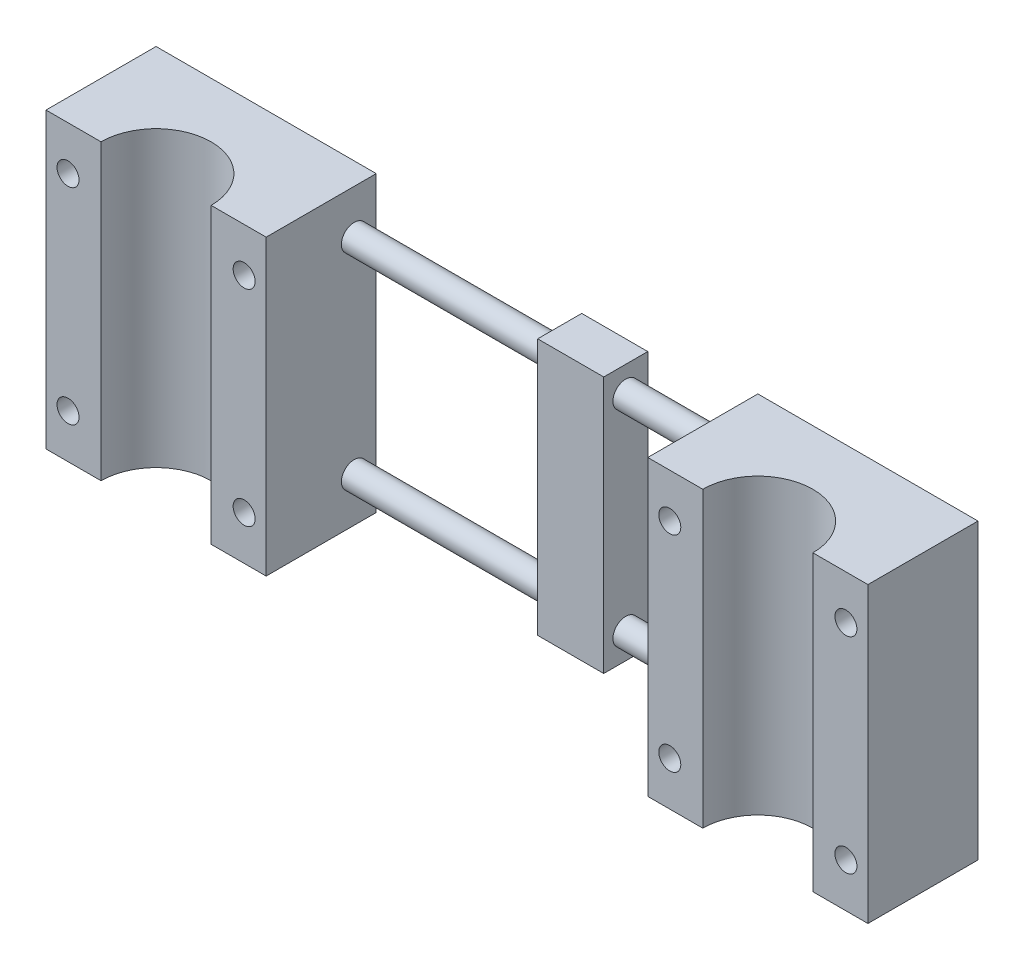
ISO-10303-21;
HEADER;
FILE_DESCRIPTION(('STEP AP214'),'2;1');
FILE_NAME('part.step','',(''),(''),'','','');
FILE_SCHEMA(('AUTOMOTIVE_DESIGN { 1 0 10303 214 1 1 1 1 }'));
ENDSEC;
DATA;
#1=APPLICATION_CONTEXT('core data for automotive mechanical design processes');
#2=APPLICATION_PROTOCOL_DEFINITION('international standard','automotive_design',2000,#1);
#3=PRODUCT_CONTEXT('',#1,'mechanical');
#4=PRODUCT('Part','Part','',(#3));
#5=PRODUCT_RELATED_PRODUCT_CATEGORY('part','',(#4));
#6=PRODUCT_DEFINITION_FORMATION('','',#4);
#7=PRODUCT_DEFINITION_CONTEXT('part definition',#1,'design');
#8=PRODUCT_DEFINITION('design','',#6,#7);
#9=PRODUCT_DEFINITION_SHAPE('','',#8);
#10=(LENGTH_UNIT() NAMED_UNIT(*) SI_UNIT(.MILLI.,.METRE.));
#11=(NAMED_UNIT(*) PLANE_ANGLE_UNIT() SI_UNIT($,.RADIAN.));
#12=(NAMED_UNIT(*) SI_UNIT($,.STERADIAN.) SOLID_ANGLE_UNIT());
#13=UNCERTAINTY_MEASURE_WITH_UNIT(LENGTH_MEASURE(1.E-05),#10,'distance_accuracy_value','');
#14=(GEOMETRIC_REPRESENTATION_CONTEXT(3) GLOBAL_UNCERTAINTY_ASSIGNED_CONTEXT((#13)) GLOBAL_UNIT_ASSIGNED_CONTEXT((#10,
#11,#12)) REPRESENTATION_CONTEXT('',''));
#15=CARTESIAN_POINT('',(0.,0.,0.));
#16=DIRECTION('',(0.,0.,1.));
#17=DIRECTION('',(1.,0.,0.));
#18=AXIS2_PLACEMENT_3D('',#15,#16,#17);
#19=CARTESIAN_POINT('',(112.,40.,15.));
#20=DIRECTION('',(0.,0.,-1.));
#21=DIRECTION('',(-1.,0.,0.));
#22=AXIS2_PLACEMENT_3D('',#19,#20,#21);
#23=PLANE('',#22);
#24=CARTESIAN_POINT('',(85.,6.,15.));
#25=DIRECTION('',(0.,0.,1.));
#26=DIRECTION('',(1.,0.,0.));
#27=AXIS2_PLACEMENT_3D('',#24,#25,#26);
#28=CIRCLE('',#27,1.5);
#29=CARTESIAN_POINT('',(86.5,6.,15.));
#30=VERTEX_POINT('',#29);
#31=EDGE_CURVE('E368',#30,#30,#28,.T.);
#32=ORIENTED_EDGE('',*,*,#31,.F.);
#33=EDGE_LOOP('',(#32));
#34=FACE_BOUND('',#33,.T.);
#35=CARTESIAN_POINT('',(85.,34.,15.));
#36=DIRECTION('',(0.,0.,1.));
#37=DIRECTION('',(1.,0.,0.));
#38=AXIS2_PLACEMENT_3D('',#35,#36,#37);
#39=CIRCLE('',#38,1.5);
#40=CARTESIAN_POINT('',(86.5,34.,15.));
#41=VERTEX_POINT('',#40);
#42=EDGE_CURVE('E296',#41,#41,#39,.T.);
#43=ORIENTED_EDGE('',*,*,#42,.F.);
#44=EDGE_LOOP('',(#43));
#45=FACE_BOUND('',#44,.T.);
#46=DIRECTION('',(-1.,0.,0.));
#47=VECTOR('',#46,1.);
#48=CARTESIAN_POINT('',(112.,0.,15.));
#49=LINE('',#48,#47);
#50=CARTESIAN_POINT('',(89.5,0.,15.));
#51=VERTEX_POINT('',#50);
#52=CARTESIAN_POINT('',(82.,0.,15.));
#53=VERTEX_POINT('',#52);
#54=EDGE_CURVE('E162',#51,#53,#49,.T.);
#55=ORIENTED_EDGE('',*,*,#54,.F.);
#56=DIRECTION('',(0.,1.,0.));
#57=VECTOR('',#56,1.);
#58=CARTESIAN_POINT('',(89.5,-19.,15.));
#59=LINE('',#58,#57);
#60=CARTESIAN_POINT('',(89.5,40.,15.));
#61=VERTEX_POINT('',#60);
#62=EDGE_CURVE('E52',#51,#61,#59,.T.);
#63=ORIENTED_EDGE('',*,*,#62,.T.);
#64=DIRECTION('',(-1.,0.,0.));
#65=VECTOR('',#64,1.);
#66=CARTESIAN_POINT('',(112.,40.,15.));
#67=LINE('',#66,#65);
#68=CARTESIAN_POINT('',(82.,40.,15.));
#69=VERTEX_POINT('',#68);
#70=EDGE_CURVE('E160',#61,#69,#67,.T.);
#71=ORIENTED_EDGE('',*,*,#70,.T.);
#72=DIRECTION('',(0.,-1.,0.));
#73=VECTOR('',#72,1.);
#74=CARTESIAN_POINT('',(82.,40.,15.));
#75=LINE('',#74,#73);
#76=EDGE_CURVE('E324',#69,#53,#75,.T.);
#77=ORIENTED_EDGE('',*,*,#76,.T.);
#78=EDGE_LOOP('',(#55,#63,#71,#77));
#79=FACE_BOUND('',#78,.T.);
#80=ADVANCED_FACE('F35',(#34,#45,#79),#23,.F.);
#81=CARTESIAN_POINT('',(0.,0.,15.));
#82=DIRECTION('',(0.,0.,-1.));
#83=DIRECTION('',(-1.,0.,0.));
#84=AXIS2_PLACEMENT_3D('',#81,#82,#83);
#85=PLANE('',#84);
#86=CARTESIAN_POINT('',(3.,6.,15.));
#87=DIRECTION('',(0.,0.,1.));
#88=DIRECTION('',(1.,0.,0.));
#89=AXIS2_PLACEMENT_3D('',#86,#87,#88);
#90=CIRCLE('',#89,1.5);
#91=CARTESIAN_POINT('',(4.5,6.,15.));
#92=VERTEX_POINT('',#91);
#93=EDGE_CURVE('E220',#92,#92,#90,.T.);
#94=ORIENTED_EDGE('',*,*,#93,.F.);
#95=EDGE_LOOP('',(#94));
#96=FACE_BOUND('',#95,.T.);
#97=CARTESIAN_POINT('',(3.,34.,15.));
#98=DIRECTION('',(0.,0.,1.));
#99=DIRECTION('',(1.,0.,0.));
#100=AXIS2_PLACEMENT_3D('',#97,#98,#99);
#101=CIRCLE('',#100,1.5);
#102=CARTESIAN_POINT('',(4.5,34.,15.));
#103=VERTEX_POINT('',#102);
#104=EDGE_CURVE('E229',#103,#103,#101,.T.);
#105=ORIENTED_EDGE('',*,*,#104,.F.);
#106=EDGE_LOOP('',(#105));
#107=FACE_BOUND('',#106,.T.);
#108=DIRECTION('',(1.,0.,0.));
#109=VECTOR('',#108,1.);
#110=CARTESIAN_POINT('',(0.,0.,15.));
#111=LINE('',#110,#109);
#112=CARTESIAN_POINT('',(0.,0.,15.));
#113=VERTEX_POINT('',#112);
#114=CARTESIAN_POINT('',(7.5,0.,15.));
#115=VERTEX_POINT('',#114);
#116=EDGE_CURVE('E243',#113,#115,#111,.T.);
#117=ORIENTED_EDGE('',*,*,#116,.T.);
#118=DIRECTION('',(0.,1.,0.));
#119=VECTOR('',#118,1.);
#120=CARTESIAN_POINT('',(7.5,-9.00000000000001,15.));
#121=LINE('',#120,#119);
#122=CARTESIAN_POINT('',(7.5,40.,15.));
#123=VERTEX_POINT('',#122);
#124=EDGE_CURVE('E273',#115,#123,#121,.T.);
#125=ORIENTED_EDGE('',*,*,#124,.T.);
#126=DIRECTION('',(-1.,0.,0.));
#127=VECTOR('',#126,1.);
#128=CARTESIAN_POINT('',(0.,40.,15.));
#129=LINE('',#128,#127);
#130=CARTESIAN_POINT('',(0.,40.,15.));
#131=VERTEX_POINT('',#130);
#132=EDGE_CURVE('E248',#123,#131,#129,.T.);
#133=ORIENTED_EDGE('',*,*,#132,.T.);
#134=DIRECTION('',(0.,-1.,0.));
#135=VECTOR('',#134,1.);
#136=CARTESIAN_POINT('',(0.,0.,15.));
#137=LINE('',#136,#135);
#138=EDGE_CURVE('E238',#131,#113,#137,.T.);
#139=ORIENTED_EDGE('',*,*,#138,.T.);
#140=EDGE_LOOP('',(#117,#125,#133,#139));
#141=FACE_BOUND('',#140,.T.);
#142=ADVANCED_FACE('F357',(#96,#107,#141),#85,.F.);
#143=CARTESIAN_POINT('',(0.,0.,15.));
#144=DIRECTION('',(1.,0.,0.));
#145=DIRECTION('',(0.,0.,-1.));
#146=AXIS2_PLACEMENT_3D('',#143,#144,#145);
#147=PLANE('',#146);
#148=DIRECTION('',(0.,-1.,0.));
#149=VECTOR('',#148,1.);
#150=CARTESIAN_POINT('',(0.,0.,0.));
#151=LINE('',#150,#149);
#152=CARTESIAN_POINT('',(0.,40.,0.));
#153=VERTEX_POINT('',#152);
#154=CARTESIAN_POINT('',(0.,0.,0.));
#155=VERTEX_POINT('',#154);
#156=EDGE_CURVE('E237',#153,#155,#151,.T.);
#157=ORIENTED_EDGE('',*,*,#156,.T.);
#158=DIRECTION('',(0.,0.,-1.));
#159=VECTOR('',#158,1.);
#160=CARTESIAN_POINT('',(0.,0.,15.));
#161=LINE('',#160,#159);
#162=EDGE_CURVE('E268',#113,#155,#161,.T.);
#163=ORIENTED_EDGE('',*,*,#162,.F.);
#164=ORIENTED_EDGE('',*,*,#138,.F.);
#165=DIRECTION('',(0.,0.,-1.));
#166=VECTOR('',#165,1.);
#167=CARTESIAN_POINT('',(0.,40.,15.));
#168=LINE('',#167,#166);
#169=EDGE_CURVE('E252',#131,#153,#168,.T.);
#170=ORIENTED_EDGE('',*,*,#169,.T.);
#171=EDGE_LOOP('',(#157,#163,#164,#170));
#172=FACE_BOUND('',#171,.T.);
#173=ADVANCED_FACE('F37',(#172),#147,.F.);
#174=CARTESIAN_POINT('',(0.,0.,15.));
#175=DIRECTION('',(0.,1.,0.));
#176=DIRECTION('',(0.,0.,1.));
#177=AXIS2_PLACEMENT_3D('',#174,#175,#176);
#178=PLANE('',#177);
#179=CARTESIAN_POINT('',(22.5,0.,15.));
#180=VERTEX_POINT('',#179);
#181=CARTESIAN_POINT('',(30.,0.,15.));
#182=VERTEX_POINT('',#181);
#183=EDGE_CURVE('E241',#180,#182,#111,.T.);
#184=ORIENTED_EDGE('',*,*,#183,.F.);
#185=CARTESIAN_POINT('',(15.,0.,15.));
#186=DIRECTION('',(0.,1.,0.));
#187=DIRECTION('',(0.,0.,1.));
#188=AXIS2_PLACEMENT_3D('',#185,#186,#187);
#189=CIRCLE('',#188,7.5);
#190=EDGE_CURVE('E59',#180,#115,#189,.T.);
#191=ORIENTED_EDGE('',*,*,#190,.T.);
#192=ORIENTED_EDGE('',*,*,#116,.F.);
#193=ORIENTED_EDGE('',*,*,#162,.T.);
#194=DIRECTION('',(1.,0.,0.));
#195=VECTOR('',#194,1.);
#196=CARTESIAN_POINT('',(0.,0.,0.));
#197=LINE('',#196,#195);
#198=CARTESIAN_POINT('',(30.,0.,0.));
#199=VERTEX_POINT('',#198);
#200=EDGE_CURVE('E255',#155,#199,#197,.T.);
#201=ORIENTED_EDGE('',*,*,#200,.T.);
#202=DIRECTION('',(0.,0.,-1.));
#203=VECTOR('',#202,1.);
#204=CARTESIAN_POINT('',(30.,0.,15.));
#205=LINE('',#204,#203);
#206=EDGE_CURVE('E265',#182,#199,#205,.T.);
#207=ORIENTED_EDGE('',*,*,#206,.F.);
#208=EDGE_LOOP('',(#184,#191,#192,#193,#201,#207));
#209=FACE_BOUND('',#208,.T.);
#210=ADVANCED_FACE('F507',(#209),#178,.F.);
#211=CARTESIAN_POINT('',(30.,0.,15.));
#212=DIRECTION('',(-1.,0.,0.));
#213=DIRECTION('',(0.,0.,1.));
#214=AXIS2_PLACEMENT_3D('',#211,#212,#213);
#215=PLANE('',#214);
#216=CARTESIAN_POINT('',(30.,6.,3.));
#217=DIRECTION('',(-1.,0.,0.));
#218=DIRECTION('',(0.,0.,1.));
#219=AXIS2_PLACEMENT_3D('',#216,#217,#218);
#220=CIRCLE('',#219,1.75);
#221=CARTESIAN_POINT('',(30.,6.,4.75));
#222=VERTEX_POINT('',#221);
#223=EDGE_CURVE('E288',#222,#222,#220,.F.);
#224=ORIENTED_EDGE('',*,*,#223,.F.);
#225=EDGE_LOOP('',(#224));
#226=FACE_BOUND('',#225,.T.);
#227=CARTESIAN_POINT('',(30.,34.,3.));
#228=DIRECTION('',(-1.,0.,0.));
#229=DIRECTION('',(0.,0.,1.));
#230=AXIS2_PLACEMENT_3D('',#227,#228,#229);
#231=CIRCLE('',#230,1.75);
#232=CARTESIAN_POINT('',(30.,34.,4.75));
#233=VERTEX_POINT('',#232);
#234=EDGE_CURVE('E276',#233,#233,#231,.F.);
#235=ORIENTED_EDGE('',*,*,#234,.F.);
#236=EDGE_LOOP('',(#235));
#237=FACE_BOUND('',#236,.T.);
#238=DIRECTION('',(0.,1.,0.));
#239=VECTOR('',#238,1.);
#240=CARTESIAN_POINT('',(30.,0.,0.));
#241=LINE('',#240,#239);
#242=CARTESIAN_POINT('',(30.,40.,0.));
#243=VERTEX_POINT('',#242);
#244=EDGE_CURVE('E257',#199,#243,#241,.T.);
#245=ORIENTED_EDGE('',*,*,#244,.T.);
#246=DIRECTION('',(0.,0.,-1.));
#247=VECTOR('',#246,1.);
#248=CARTESIAN_POINT('',(30.,40.,15.));
#249=LINE('',#248,#247);
#250=CARTESIAN_POINT('',(30.,40.,15.));
#251=VERTEX_POINT('',#250);
#252=EDGE_CURVE('E262',#251,#243,#249,.T.);
#253=ORIENTED_EDGE('',*,*,#252,.F.);
#254=DIRECTION('',(0.,1.,0.));
#255=VECTOR('',#254,1.);
#256=CARTESIAN_POINT('',(30.,0.,15.));
#257=LINE('',#256,#255);
#258=EDGE_CURVE('E246',#182,#251,#257,.T.);
#259=ORIENTED_EDGE('',*,*,#258,.F.);
#260=ORIENTED_EDGE('',*,*,#206,.T.);
#261=EDGE_LOOP('',(#245,#253,#259,#260));
#262=FACE_BOUND('',#261,.T.);
#263=ADVANCED_FACE('F504',(#226,#237,#262),#215,.F.);
#264=CARTESIAN_POINT('',(0.,40.,15.));
#265=DIRECTION('',(0.,-1.,0.));
#266=DIRECTION('',(0.,0.,-1.));
#267=AXIS2_PLACEMENT_3D('',#264,#265,#266);
#268=PLANE('',#267);
#269=ORIENTED_EDGE('',*,*,#132,.F.);
#270=CARTESIAN_POINT('',(15.,40.,15.));
#271=DIRECTION('',(0.,1.,0.));
#272=DIRECTION('',(0.,0.,1.));
#273=AXIS2_PLACEMENT_3D('',#270,#271,#272);
#274=CIRCLE('',#273,7.5);
#275=CARTESIAN_POINT('',(22.5,40.,15.));
#276=VERTEX_POINT('',#275);
#277=EDGE_CURVE('E234',#276,#123,#274,.T.);
#278=ORIENTED_EDGE('',*,*,#277,.F.);
#279=EDGE_CURVE('E249',#251,#276,#129,.T.);
#280=ORIENTED_EDGE('',*,*,#279,.F.);
#281=ORIENTED_EDGE('',*,*,#252,.T.);
#282=DIRECTION('',(-1.,0.,0.));
#283=VECTOR('',#282,1.);
#284=CARTESIAN_POINT('',(0.,40.,0.));
#285=LINE('',#284,#283);
#286=EDGE_CURVE('E242',#243,#153,#285,.T.);
#287=ORIENTED_EDGE('',*,*,#286,.T.);
#288=ORIENTED_EDGE('',*,*,#169,.F.);
#289=EDGE_LOOP('',(#269,#278,#280,#281,#287,#288));
#290=FACE_BOUND('',#289,.T.);
#291=ADVANCED_FACE('F497',(#290),#268,.F.);
#292=CARTESIAN_POINT('',(27.,34.,15.));
#293=DIRECTION('',(0.,0.,1.));
#294=DIRECTION('',(1.,0.,0.));
#295=AXIS2_PLACEMENT_3D('',#292,#293,#294);
#296=CIRCLE('',#295,1.5);
#297=CARTESIAN_POINT('',(28.5,34.,15.));
#298=VERTEX_POINT('',#297);
#299=EDGE_CURVE('E224',#298,#298,#296,.T.);
#300=ORIENTED_EDGE('',*,*,#299,.F.);
#301=EDGE_LOOP('',(#300));
#302=FACE_BOUND('',#301,.T.);
#303=CARTESIAN_POINT('',(27.,6.,15.));
#304=DIRECTION('',(0.,0.,1.));
#305=DIRECTION('',(1.,0.,0.));
#306=AXIS2_PLACEMENT_3D('',#303,#304,#305);
#307=CIRCLE('',#306,1.5);
#308=CARTESIAN_POINT('',(28.5,6.,15.));
#309=VERTEX_POINT('',#308);
#310=EDGE_CURVE('E219',#309,#309,#307,.T.);
#311=ORIENTED_EDGE('',*,*,#310,.F.);
#312=EDGE_LOOP('',(#311));
#313=FACE_BOUND('',#312,.T.);
#314=ORIENTED_EDGE('',*,*,#279,.T.);
#315=DIRECTION('',(0.,1.,0.));
#316=VECTOR('',#315,1.);
#317=CARTESIAN_POINT('',(22.5,-9.00000000000001,15.));
#318=LINE('',#317,#316);
#319=EDGE_CURVE('E271',#276,#180,#318,.F.);
#320=ORIENTED_EDGE('',*,*,#319,.T.);
#321=ORIENTED_EDGE('',*,*,#183,.T.);
#322=ORIENTED_EDGE('',*,*,#258,.T.);
#323=EDGE_LOOP('',(#314,#320,#321,#322));
#324=FACE_BOUND('',#323,.T.);
#325=ADVANCED_FACE('F364',(#302,#313,#324),#85,.F.);
#326=CARTESIAN_POINT('',(0.,0.,0.));
#327=DIRECTION('',(0.,0.,-1.));
#328=DIRECTION('',(-1.,0.,0.));
#329=AXIS2_PLACEMENT_3D('',#326,#327,#328);
#330=PLANE('',#329);
#331=CARTESIAN_POINT('',(3.,6.,0.));
#332=DIRECTION('',(0.,0.,-1.));
#333=DIRECTION('',(-1.,0.,0.));
#334=AXIS2_PLACEMENT_3D('',#331,#332,#333);
#335=CIRCLE('',#334,1.5);
#336=CARTESIAN_POINT('',(1.5,6.,0.));
#337=VERTEX_POINT('',#336);
#338=EDGE_CURVE('E233',#337,#337,#335,.T.);
#339=ORIENTED_EDGE('',*,*,#338,.F.);
#340=EDGE_LOOP('',(#339));
#341=FACE_BOUND('',#340,.T.);
#342=CARTESIAN_POINT('',(27.,34.,0.));
#343=DIRECTION('',(0.,0.,-1.));
#344=DIRECTION('',(-1.,0.,0.));
#345=AXIS2_PLACEMENT_3D('',#342,#343,#344);
#346=CIRCLE('',#345,1.5);
#347=CARTESIAN_POINT('',(25.5,34.,0.));
#348=VERTEX_POINT('',#347);
#349=EDGE_CURVE('E281',#348,#348,#346,.T.);
#350=ORIENTED_EDGE('',*,*,#349,.F.);
#351=EDGE_LOOP('',(#350));
#352=FACE_BOUND('',#351,.T.);
#353=CARTESIAN_POINT('',(27.,6.,0.));
#354=DIRECTION('',(0.,0.,-1.));
#355=DIRECTION('',(-1.,0.,0.));
#356=AXIS2_PLACEMENT_3D('',#353,#354,#355);
#357=CIRCLE('',#356,1.5);
#358=CARTESIAN_POINT('',(25.5,6.,0.));
#359=VERTEX_POINT('',#358);
#360=EDGE_CURVE('E223',#359,#359,#357,.T.);
#361=ORIENTED_EDGE('',*,*,#360,.F.);
#362=EDGE_LOOP('',(#361));
#363=FACE_BOUND('',#362,.T.);
#364=CARTESIAN_POINT('',(3.,34.,0.));
#365=DIRECTION('',(0.,0.,-1.));
#366=DIRECTION('',(-1.,0.,0.));
#367=AXIS2_PLACEMENT_3D('',#364,#365,#366);
#368=CIRCLE('',#367,1.5);
#369=CARTESIAN_POINT('',(1.5,34.,0.));
#370=VERTEX_POINT('',#369);
#371=EDGE_CURVE('E232',#370,#370,#368,.T.);
#372=ORIENTED_EDGE('',*,*,#371,.F.);
#373=EDGE_LOOP('',(#372));
#374=FACE_BOUND('',#373,.T.);
#375=ORIENTED_EDGE('',*,*,#156,.F.);
#376=ORIENTED_EDGE('',*,*,#286,.F.);
#377=ORIENTED_EDGE('',*,*,#244,.F.);
#378=ORIENTED_EDGE('',*,*,#200,.F.);
#379=EDGE_LOOP('',(#375,#376,#377,#378));
#380=FACE_BOUND('',#379,.T.);
#381=ADVANCED_FACE('F494',(#341,#352,#363,#374,#380),#330,.T.);
#382=CARTESIAN_POINT('',(15.,-9.00000000000001,15.));
#383=DIRECTION('',(0.,1.,0.));
#384=DIRECTION('',(0.,0.,1.));
#385=AXIS2_PLACEMENT_3D('',#382,#383,#384);
#386=CYLINDRICAL_SURFACE('',#385,7.5);
#387=ORIENTED_EDGE('',*,*,#319,.F.);
#388=ORIENTED_EDGE('',*,*,#277,.T.);
#389=ORIENTED_EDGE('',*,*,#124,.F.);
#390=ORIENTED_EDGE('',*,*,#190,.F.);
#391=EDGE_LOOP('',(#387,#388,#389,#390));
#392=FACE_BOUND('',#391,.T.);
#393=ADVANCED_FACE('F491',(#392),#386,.F.);
#394=CARTESIAN_POINT('',(3.,34.,-34.));
#395=DIRECTION('',(0.,0.,1.));
#396=DIRECTION('',(1.,0.,0.));
#397=AXIS2_PLACEMENT_3D('',#394,#395,#396);
#398=CYLINDRICAL_SURFACE('',#397,1.5);
#399=ORIENTED_EDGE('',*,*,#371,.T.);
#400=EDGE_LOOP('',(#399));
#401=FACE_BOUND('',#400,.T.);
#402=ORIENTED_EDGE('',*,*,#104,.T.);
#403=EDGE_LOOP('',(#402));
#404=FACE_BOUND('',#403,.T.);
#405=ADVANCED_FACE('F487',(#401,#404),#398,.F.);
#406=CARTESIAN_POINT('',(27.,6.,-34.));
#407=DIRECTION('',(0.,0.,1.));
#408=DIRECTION('',(1.,0.,0.));
#409=AXIS2_PLACEMENT_3D('',#406,#407,#408);
#410=CYLINDRICAL_SURFACE('',#409,1.5);
#411=ORIENTED_EDGE('',*,*,#360,.T.);
#412=EDGE_LOOP('',(#411));
#413=FACE_BOUND('',#412,.T.);
#414=ORIENTED_EDGE('',*,*,#310,.T.);
#415=EDGE_LOOP('',(#414));
#416=FACE_BOUND('',#415,.T.);
#417=ADVANCED_FACE('F483',(#413,#416),#410,.F.);
#418=CARTESIAN_POINT('',(27.,34.,-34.));
#419=DIRECTION('',(0.,0.,1.));
#420=DIRECTION('',(1.,0.,0.));
#421=AXIS2_PLACEMENT_3D('',#418,#419,#420);
#422=CYLINDRICAL_SURFACE('',#421,1.5);
#423=ORIENTED_EDGE('',*,*,#349,.T.);
#424=EDGE_LOOP('',(#423));
#425=FACE_BOUND('',#424,.T.);
#426=ORIENTED_EDGE('',*,*,#299,.T.);
#427=EDGE_LOOP('',(#426));
#428=FACE_BOUND('',#427,.T.);
#429=ADVANCED_FACE('F479',(#425,#428),#422,.F.);
#430=CARTESIAN_POINT('',(3.,6.,-34.));
#431=DIRECTION('',(0.,0.,1.));
#432=DIRECTION('',(1.,0.,0.));
#433=AXIS2_PLACEMENT_3D('',#430,#431,#432);
#434=CYLINDRICAL_SURFACE('',#433,1.5);
#435=ORIENTED_EDGE('',*,*,#338,.T.);
#436=EDGE_LOOP('',(#435));
#437=FACE_BOUND('',#436,.T.);
#438=ORIENTED_EDGE('',*,*,#93,.T.);
#439=EDGE_LOOP('',(#438));
#440=FACE_BOUND('',#439,.T.);
#441=ADVANCED_FACE('F475',(#437,#440),#434,.F.);
#442=CARTESIAN_POINT('',(58.,34.,3.));
#443=DIRECTION('',(-1.,0.,0.));
#444=DIRECTION('',(0.,0.,1.));
#445=AXIS2_PLACEMENT_3D('',#442,#443,#444);
#446=CYLINDRICAL_SURFACE('',#445,1.75);
#447=CARTESIAN_POINT('',(58.,34.,3.));
#448=DIRECTION('',(1.,0.,0.));
#449=DIRECTION('',(0.,0.,-1.));
#450=AXIS2_PLACEMENT_3D('',#447,#448,#449);
#451=CIRCLE('',#450,1.75);
#452=CARTESIAN_POINT('',(58.,34.,1.25));
#453=VERTEX_POINT('',#452);
#454=EDGE_CURVE('E216',#453,#453,#451,.T.);
#455=ORIENTED_EDGE('',*,*,#454,.F.);
#456=EDGE_LOOP('',(#455));
#457=FACE_BOUND('',#456,.T.);
#458=ORIENTED_EDGE('',*,*,#234,.T.);
#459=EDGE_LOOP('',(#458));
#460=FACE_BOUND('',#459,.T.);
#461=ADVANCED_FACE('F471',(#457,#460),#446,.T.);
#462=CARTESIAN_POINT('',(58.,6.,3.));
#463=DIRECTION('',(-1.,0.,0.));
#464=DIRECTION('',(0.,0.,1.));
#465=AXIS2_PLACEMENT_3D('',#462,#463,#464);
#466=CYLINDRICAL_SURFACE('',#465,1.75);
#467=CARTESIAN_POINT('',(58.,6.,3.));
#468=DIRECTION('',(1.,0.,0.));
#469=DIRECTION('',(0.,0.,-1.));
#470=AXIS2_PLACEMENT_3D('',#467,#468,#469);
#471=CIRCLE('',#470,1.75);
#472=CARTESIAN_POINT('',(58.,6.,1.25));
#473=VERTEX_POINT('',#472);
#474=EDGE_CURVE('E213',#473,#473,#471,.T.);
#475=ORIENTED_EDGE('',*,*,#474,.F.);
#476=EDGE_LOOP('',(#475));
#477=FACE_BOUND('',#476,.T.);
#478=ORIENTED_EDGE('',*,*,#223,.T.);
#479=EDGE_LOOP('',(#478));
#480=FACE_BOUND('',#479,.T.);
#481=ADVANCED_FACE('F468',(#477,#480),#466,.T.);
#482=CARTESIAN_POINT('',(67.,37.5,0.));
#483=DIRECTION('',(0.,0.,1.));
#484=DIRECTION('',(0.,-1.,0.));
#485=AXIS2_PLACEMENT_3D('',#482,#483,#484);
#486=PLANE('',#485);
#487=DIRECTION('',(0.,1.,0.));
#488=VECTOR('',#487,1.);
#489=CARTESIAN_POINT('',(58.,37.5,0.));
#490=LINE('',#489,#488);
#491=CARTESIAN_POINT('',(58.,2.5,0.));
#492=VERTEX_POINT('',#491);
#493=CARTESIAN_POINT('',(58.,37.5,0.));
#494=VERTEX_POINT('',#493);
#495=EDGE_CURVE('E183',#492,#494,#490,.T.);
#496=ORIENTED_EDGE('',*,*,#495,.T.);
#497=DIRECTION('',(-1.,0.,0.));
#498=VECTOR('',#497,1.);
#499=CARTESIAN_POINT('',(67.,37.5,0.));
#500=LINE('',#499,#498);
#501=CARTESIAN_POINT('',(67.,37.5,0.));
#502=VERTEX_POINT('',#501);
#503=EDGE_CURVE('E210',#502,#494,#500,.T.);
#504=ORIENTED_EDGE('',*,*,#503,.F.);
#505=DIRECTION('',(0.,1.,0.));
#506=VECTOR('',#505,1.);
#507=CARTESIAN_POINT('',(67.,37.5,0.));
#508=LINE('',#507,#506);
#509=CARTESIAN_POINT('',(67.,2.5,0.));
#510=VERTEX_POINT('',#509);
#511=EDGE_CURVE('E184',#510,#502,#508,.T.);
#512=ORIENTED_EDGE('',*,*,#511,.F.);
#513=DIRECTION('',(-1.,0.,0.));
#514=VECTOR('',#513,1.);
#515=CARTESIAN_POINT('',(67.,2.5,0.));
#516=LINE('',#515,#514);
#517=EDGE_CURVE('E194',#510,#492,#516,.T.);
#518=ORIENTED_EDGE('',*,*,#517,.T.);
#519=EDGE_LOOP('',(#496,#504,#512,#518));
#520=FACE_BOUND('',#519,.T.);
#521=ADVANCED_FACE('F438',(#520),#486,.F.);
#522=CARTESIAN_POINT('',(67.,37.5,0.));
#523=DIRECTION('',(0.,-1.,0.));
#524=DIRECTION('',(0.,0.,-1.));
#525=AXIS2_PLACEMENT_3D('',#522,#523,#524);
#526=PLANE('',#525);
#527=DIRECTION('',(0.,0.,1.));
#528=VECTOR('',#527,1.);
#529=CARTESIAN_POINT('',(58.,37.5,0.));
#530=LINE('',#529,#528);
#531=CARTESIAN_POINT('',(58.,37.5,6.));
#532=VERTEX_POINT('',#531);
#533=EDGE_CURVE('E197',#494,#532,#530,.T.);
#534=ORIENTED_EDGE('',*,*,#533,.T.);
#535=DIRECTION('',(-1.,0.,0.));
#536=VECTOR('',#535,1.);
#537=CARTESIAN_POINT('',(67.,37.5,6.));
#538=LINE('',#537,#536);
#539=CARTESIAN_POINT('',(67.,37.5,6.));
#540=VERTEX_POINT('',#539);
#541=EDGE_CURVE('E207',#540,#532,#538,.T.);
#542=ORIENTED_EDGE('',*,*,#541,.F.);
#543=DIRECTION('',(0.,0.,1.));
#544=VECTOR('',#543,1.);
#545=CARTESIAN_POINT('',(67.,37.5,0.));
#546=LINE('',#545,#544);
#547=EDGE_CURVE('E187',#502,#540,#546,.T.);
#548=ORIENTED_EDGE('',*,*,#547,.F.);
#549=ORIENTED_EDGE('',*,*,#503,.T.);
#550=EDGE_LOOP('',(#534,#542,#548,#549));
#551=FACE_BOUND('',#550,.T.);
#552=ADVANCED_FACE('F441',(#551),#526,.F.);
#553=CARTESIAN_POINT('',(67.,37.5,6.));
#554=DIRECTION('',(0.,0.,-1.));
#555=DIRECTION('',(0.,1.,0.));
#556=AXIS2_PLACEMENT_3D('',#553,#554,#555);
#557=PLANE('',#556);
#558=DIRECTION('',(0.,-1.,0.));
#559=VECTOR('',#558,1.);
#560=CARTESIAN_POINT('',(58.,37.5,6.));
#561=LINE('',#560,#559);
#562=CARTESIAN_POINT('',(58.,2.5,6.));
#563=VERTEX_POINT('',#562);
#564=EDGE_CURVE('E199',#532,#563,#561,.T.);
#565=ORIENTED_EDGE('',*,*,#564,.T.);
#566=DIRECTION('',(-1.,0.,0.));
#567=VECTOR('',#566,1.);
#568=CARTESIAN_POINT('',(67.,2.5,6.));
#569=LINE('',#568,#567);
#570=CARTESIAN_POINT('',(67.,2.5,6.));
#571=VERTEX_POINT('',#570);
#572=EDGE_CURVE('E204',#571,#563,#569,.T.);
#573=ORIENTED_EDGE('',*,*,#572,.F.);
#574=DIRECTION('',(0.,-1.,0.));
#575=VECTOR('',#574,1.);
#576=CARTESIAN_POINT('',(67.,37.5,6.));
#577=LINE('',#576,#575);
#578=EDGE_CURVE('E190',#540,#571,#577,.T.);
#579=ORIENTED_EDGE('',*,*,#578,.F.);
#580=ORIENTED_EDGE('',*,*,#541,.T.);
#581=EDGE_LOOP('',(#565,#573,#579,#580));
#582=FACE_BOUND('',#581,.T.);
#583=ADVANCED_FACE('F446',(#582),#557,.F.);
#584=CARTESIAN_POINT('',(67.,2.5,0.));
#585=DIRECTION('',(0.,1.,0.));
#586=DIRECTION('',(0.,0.,1.));
#587=AXIS2_PLACEMENT_3D('',#584,#585,#586);
#588=PLANE('',#587);
#589=DIRECTION('',(0.,0.,-1.));
#590=VECTOR('',#589,1.);
#591=CARTESIAN_POINT('',(58.,2.5,0.));
#592=LINE('',#591,#590);
#593=EDGE_CURVE('E188',#563,#492,#592,.T.);
#594=ORIENTED_EDGE('',*,*,#593,.T.);
#595=ORIENTED_EDGE('',*,*,#517,.F.);
#596=DIRECTION('',(0.,0.,-1.));
#597=VECTOR('',#596,1.);
#598=CARTESIAN_POINT('',(67.,2.5,0.));
#599=LINE('',#598,#597);
#600=EDGE_CURVE('E192',#571,#510,#599,.T.);
#601=ORIENTED_EDGE('',*,*,#600,.F.);
#602=ORIENTED_EDGE('',*,*,#572,.T.);
#603=EDGE_LOOP('',(#594,#595,#601,#602));
#604=FACE_BOUND('',#603,.T.);
#605=ADVANCED_FACE('F428',(#604),#588,.F.);
#606=CARTESIAN_POINT('',(67.,0.,0.));
#607=DIRECTION('',(-1.,0.,0.));
#608=DIRECTION('',(0.,0.,1.));
#609=AXIS2_PLACEMENT_3D('',#606,#607,#608);
#610=PLANE('',#609);
#611=CARTESIAN_POINT('',(67.,6.,3.));
#612=DIRECTION('',(-1.,0.,0.));
#613=DIRECTION('',(0.,0.,1.));
#614=AXIS2_PLACEMENT_3D('',#611,#612,#613);
#615=CIRCLE('',#614,1.75);
#616=CARTESIAN_POINT('',(67.,6.,4.75));
#617=VERTEX_POINT('',#616);
#618=EDGE_CURVE('E44',#617,#617,#615,.F.);
#619=ORIENTED_EDGE('',*,*,#618,.F.);
#620=EDGE_LOOP('',(#619));
#621=FACE_BOUND('',#620,.T.);
#622=CARTESIAN_POINT('',(67.,34.,3.));
#623=DIRECTION('',(-1.,0.,0.));
#624=DIRECTION('',(0.,0.,1.));
#625=AXIS2_PLACEMENT_3D('',#622,#623,#624);
#626=CIRCLE('',#625,1.75);
#627=CARTESIAN_POINT('',(67.,34.,4.75));
#628=VERTEX_POINT('',#627);
#629=EDGE_CURVE('E291',#628,#628,#626,.F.);
#630=ORIENTED_EDGE('',*,*,#629,.F.);
#631=EDGE_LOOP('',(#630));
#632=FACE_BOUND('',#631,.T.);
#633=ORIENTED_EDGE('',*,*,#511,.T.);
#634=ORIENTED_EDGE('',*,*,#547,.T.);
#635=ORIENTED_EDGE('',*,*,#578,.T.);
#636=ORIENTED_EDGE('',*,*,#600,.T.);
#637=EDGE_LOOP('',(#633,#634,#635,#636));
#638=FACE_BOUND('',#637,.T.);
#639=ADVANCED_FACE('F424',(#621,#632,#638),#610,.F.);
#640=CARTESIAN_POINT('',(58.,0.,0.));
#641=DIRECTION('',(-1.,0.,0.));
#642=DIRECTION('',(0.,0.,1.));
#643=AXIS2_PLACEMENT_3D('',#640,#641,#642);
#644=PLANE('',#643);
#645=ORIENTED_EDGE('',*,*,#454,.T.);
#646=EDGE_LOOP('',(#645));
#647=FACE_BOUND('',#646,.T.);
#648=ORIENTED_EDGE('',*,*,#474,.T.);
#649=EDGE_LOOP('',(#648));
#650=FACE_BOUND('',#649,.T.);
#651=ORIENTED_EDGE('',*,*,#495,.F.);
#652=ORIENTED_EDGE('',*,*,#593,.F.);
#653=ORIENTED_EDGE('',*,*,#564,.F.);
#654=ORIENTED_EDGE('',*,*,#533,.F.);
#655=EDGE_LOOP('',(#651,#652,#653,#654));
#656=FACE_BOUND('',#655,.T.);
#657=ADVANCED_FACE('F427',(#647,#650,#656),#644,.T.);
#658=CARTESIAN_POINT('',(82.,34.,3.));
#659=DIRECTION('',(-1.,0.,0.));
#660=DIRECTION('',(0.,0.,1.));
#661=AXIS2_PLACEMENT_3D('',#658,#659,#660);
#662=CYLINDRICAL_SURFACE('',#661,1.75);
#663=CARTESIAN_POINT('',(82.,34.,3.));
#664=DIRECTION('',(1.,0.,0.));
#665=DIRECTION('',(0.,0.,-1.));
#666=AXIS2_PLACEMENT_3D('',#663,#664,#665);
#667=CIRCLE('',#666,1.75);
#668=CARTESIAN_POINT('',(82.,34.,1.25));
#669=VERTEX_POINT('',#668);
#670=EDGE_CURVE('E180',#669,#669,#667,.T.);
#671=ORIENTED_EDGE('',*,*,#670,.F.);
#672=EDGE_LOOP('',(#671));
#673=FACE_BOUND('',#672,.T.);
#674=ORIENTED_EDGE('',*,*,#629,.T.);
#675=EDGE_LOOP('',(#674));
#676=FACE_BOUND('',#675,.T.);
#677=ADVANCED_FACE('F420',(#673,#676),#662,.T.);
#678=CARTESIAN_POINT('',(82.,6.,3.));
#679=DIRECTION('',(-1.,0.,0.));
#680=DIRECTION('',(0.,0.,1.));
#681=AXIS2_PLACEMENT_3D('',#678,#679,#680);
#682=CYLINDRICAL_SURFACE('',#681,1.75);
#683=CARTESIAN_POINT('',(82.,6.,3.));
#684=DIRECTION('',(1.,0.,0.));
#685=DIRECTION('',(0.,0.,-1.));
#686=AXIS2_PLACEMENT_3D('',#683,#684,#685);
#687=CIRCLE('',#686,1.75);
#688=CARTESIAN_POINT('',(82.,6.,1.25));
#689=VERTEX_POINT('',#688);
#690=EDGE_CURVE('E177',#689,#689,#687,.T.);
#691=ORIENTED_EDGE('',*,*,#690,.F.);
#692=EDGE_LOOP('',(#691));
#693=FACE_BOUND('',#692,.T.);
#694=ORIENTED_EDGE('',*,*,#618,.T.);
#695=EDGE_LOOP('',(#694));
#696=FACE_BOUND('',#695,.T.);
#697=ADVANCED_FACE('F392',(#693,#696),#682,.T.);
#698=CARTESIAN_POINT('',(112.,40.,0.));
#699=DIRECTION('',(0.,0.,1.));
#700=DIRECTION('',(1.,0.,0.));
#701=AXIS2_PLACEMENT_3D('',#698,#699,#700);
#702=PLANE('',#701);
#703=CARTESIAN_POINT('',(109.,34.,0.));
#704=DIRECTION('',(0.,0.,1.));
#705=DIRECTION('',(1.,0.,0.));
#706=AXIS2_PLACEMENT_3D('',#703,#704,#705);
#707=CIRCLE('',#706,1.5);
#708=CARTESIAN_POINT('',(110.5,34.,0.));
#709=VERTEX_POINT('',#708);
#710=EDGE_CURVE('E304',#709,#709,#707,.T.);
#711=ORIENTED_EDGE('',*,*,#710,.T.);
#712=EDGE_LOOP('',(#711));
#713=FACE_BOUND('',#712,.T.);
#714=CARTESIAN_POINT('',(109.,6.,0.));
#715=DIRECTION('',(0.,0.,1.));
#716=DIRECTION('',(1.,0.,0.));
#717=AXIS2_PLACEMENT_3D('',#714,#715,#716);
#718=CIRCLE('',#717,1.5);
#719=CARTESIAN_POINT('',(110.5,6.,0.));
#720=VERTEX_POINT('',#719);
#721=EDGE_CURVE('E376',#720,#720,#718,.T.);
#722=ORIENTED_EDGE('',*,*,#721,.T.);
#723=EDGE_LOOP('',(#722));
#724=FACE_BOUND('',#723,.T.);
#725=CARTESIAN_POINT('',(85.,6.,0.));
#726=DIRECTION('',(0.,0.,1.));
#727=DIRECTION('',(1.,0.,0.));
#728=AXIS2_PLACEMENT_3D('',#725,#726,#727);
#729=CIRCLE('',#728,1.5);
#730=CARTESIAN_POINT('',(86.5,6.,0.));
#731=VERTEX_POINT('',#730);
#732=EDGE_CURVE('E39',#731,#731,#729,.T.);
#733=ORIENTED_EDGE('',*,*,#732,.T.);
#734=EDGE_LOOP('',(#733));
#735=FACE_BOUND('',#734,.T.);
#736=CARTESIAN_POINT('',(85.,34.,0.));
#737=DIRECTION('',(0.,0.,1.));
#738=DIRECTION('',(1.,0.,0.));
#739=AXIS2_PLACEMENT_3D('',#736,#737,#738);
#740=CIRCLE('',#739,1.5);
#741=CARTESIAN_POINT('',(86.5,34.,0.));
#742=VERTEX_POINT('',#741);
#743=EDGE_CURVE('E155',#742,#742,#740,.T.);
#744=ORIENTED_EDGE('',*,*,#743,.T.);
#745=EDGE_LOOP('',(#744));
#746=FACE_BOUND('',#745,.T.);
#747=DIRECTION('',(0.,1.,0.));
#748=VECTOR('',#747,1.);
#749=CARTESIAN_POINT('',(82.,40.,0.));
#750=LINE('',#749,#748);
#751=CARTESIAN_POINT('',(82.,0.,0.));
#752=VERTEX_POINT('',#751);
#753=CARTESIAN_POINT('',(82.,40.,0.));
#754=VERTEX_POINT('',#753);
#755=EDGE_CURVE('E308',#752,#754,#750,.T.);
#756=ORIENTED_EDGE('',*,*,#755,.T.);
#757=DIRECTION('',(-1.,0.,0.));
#758=VECTOR('',#757,1.);
#759=CARTESIAN_POINT('',(112.,40.,0.));
#760=LINE('',#759,#758);
#761=CARTESIAN_POINT('',(112.,40.,0.));
#762=VERTEX_POINT('',#761);
#763=EDGE_CURVE('E171',#762,#754,#760,.T.);
#764=ORIENTED_EDGE('',*,*,#763,.F.);
#765=DIRECTION('',(0.,1.,0.));
#766=VECTOR('',#765,1.);
#767=CARTESIAN_POINT('',(112.,40.,0.));
#768=LINE('',#767,#766);
#769=CARTESIAN_POINT('',(112.,0.,0.));
#770=VERTEX_POINT('',#769);
#771=EDGE_CURVE('E310',#770,#762,#768,.T.);
#772=ORIENTED_EDGE('',*,*,#771,.F.);
#773=DIRECTION('',(-1.,0.,0.));
#774=VECTOR('',#773,1.);
#775=CARTESIAN_POINT('',(112.,0.,0.));
#776=LINE('',#775,#774);
#777=EDGE_CURVE('E320',#770,#752,#776,.T.);
#778=ORIENTED_EDGE('',*,*,#777,.T.);
#779=EDGE_LOOP('',(#756,#764,#772,#778));
#780=FACE_BOUND('',#779,.T.);
#781=ADVANCED_FACE('F337',(#713,#724,#735,#746,#780),#702,.F.);
#782=CARTESIAN_POINT('',(112.,40.,0.));
#783=DIRECTION('',(0.,-1.,0.));
#784=DIRECTION('',(0.,0.,-1.));
#785=AXIS2_PLACEMENT_3D('',#782,#783,#784);
#786=PLANE('',#785);
#787=ORIENTED_EDGE('',*,*,#70,.F.);
#788=CARTESIAN_POINT('',(97.,40.,15.));
#789=DIRECTION('',(0.,1.,0.));
#790=DIRECTION('',(0.,0.,1.));
#791=AXIS2_PLACEMENT_3D('',#788,#789,#790);
#792=CIRCLE('',#791,7.49999999999999);
#793=CARTESIAN_POINT('',(104.5,40.,15.));
#794=VERTEX_POINT('',#793);
#795=EDGE_CURVE('E147',#794,#61,#792,.T.);
#796=ORIENTED_EDGE('',*,*,#795,.F.);
#797=CARTESIAN_POINT('',(112.,40.,15.));
#798=VERTEX_POINT('',#797);
#799=EDGE_CURVE('E168',#798,#794,#67,.T.);
#800=ORIENTED_EDGE('',*,*,#799,.F.);
#801=DIRECTION('',(0.,0.,1.));
#802=VECTOR('',#801,1.);
#803=CARTESIAN_POINT('',(112.,40.,0.));
#804=LINE('',#803,#802);
#805=EDGE_CURVE('E313',#762,#798,#804,.T.);
#806=ORIENTED_EDGE('',*,*,#805,.F.);
#807=ORIENTED_EDGE('',*,*,#763,.T.);
#808=DIRECTION('',(0.,0.,1.));
#809=VECTOR('',#808,1.);
#810=CARTESIAN_POINT('',(82.,40.,0.));
#811=LINE('',#810,#809);
#812=EDGE_CURVE('E166',#754,#69,#811,.T.);
#813=ORIENTED_EDGE('',*,*,#812,.T.);
#814=EDGE_LOOP('',(#787,#796,#800,#806,#807,#813));
#815=FACE_BOUND('',#814,.T.);
#816=ADVANCED_FACE('F164',(#815),#786,.F.);
#817=CARTESIAN_POINT('',(109.,34.,15.));
#818=DIRECTION('',(0.,0.,1.));
#819=DIRECTION('',(1.,0.,0.));
#820=AXIS2_PLACEMENT_3D('',#817,#818,#819);
#821=CIRCLE('',#820,1.5);
#822=CARTESIAN_POINT('',(110.5,34.,15.));
#823=VERTEX_POINT('',#822);
#824=EDGE_CURVE('E373',#823,#823,#821,.T.);
#825=ORIENTED_EDGE('',*,*,#824,.F.);
#826=EDGE_LOOP('',(#825));
#827=FACE_BOUND('',#826,.T.);
#828=CARTESIAN_POINT('',(109.,6.,15.));
#829=DIRECTION('',(0.,0.,1.));
#830=DIRECTION('',(1.,0.,0.));
#831=AXIS2_PLACEMENT_3D('',#828,#829,#830);
#832=CIRCLE('',#831,1.5);
#833=CARTESIAN_POINT('',(110.5,6.,15.));
#834=VERTEX_POINT('',#833);
#835=EDGE_CURVE('E370',#834,#834,#832,.T.);
#836=ORIENTED_EDGE('',*,*,#835,.F.);
#837=EDGE_LOOP('',(#836));
#838=FACE_BOUND('',#837,.T.);
#839=ORIENTED_EDGE('',*,*,#799,.T.);
#840=DIRECTION('',(0.,1.,0.));
#841=VECTOR('',#840,1.);
#842=CARTESIAN_POINT('',(104.5,-19.,15.));
#843=LINE('',#842,#841);
#844=CARTESIAN_POINT('',(104.5,0.,15.));
#845=VERTEX_POINT('',#844);
#846=EDGE_CURVE('E150',#845,#794,#843,.T.);
#847=ORIENTED_EDGE('',*,*,#846,.F.);
#848=CARTESIAN_POINT('',(112.,0.,15.));
#849=VERTEX_POINT('',#848);
#850=EDGE_CURVE('E169',#849,#845,#49,.T.);
#851=ORIENTED_EDGE('',*,*,#850,.F.);
#852=DIRECTION('',(0.,-1.,0.));
#853=VECTOR('',#852,1.);
#854=CARTESIAN_POINT('',(112.,40.,15.));
#855=LINE('',#854,#853);
#856=EDGE_CURVE('E316',#798,#849,#855,.T.);
#857=ORIENTED_EDGE('',*,*,#856,.F.);
#858=EDGE_LOOP('',(#839,#847,#851,#857));
#859=FACE_BOUND('',#858,.T.);
#860=ADVANCED_FACE('F344',(#827,#838,#859),#23,.F.);
#861=CARTESIAN_POINT('',(112.,0.,0.));
#862=DIRECTION('',(0.,1.,0.));
#863=DIRECTION('',(0.,0.,1.));
#864=AXIS2_PLACEMENT_3D('',#861,#862,#863);
#865=PLANE('',#864);
#866=ORIENTED_EDGE('',*,*,#850,.T.);
#867=CARTESIAN_POINT('',(97.,0.,15.));
#868=DIRECTION('',(0.,1.,0.));
#869=DIRECTION('',(0.,0.,1.));
#870=AXIS2_PLACEMENT_3D('',#867,#868,#869);
#871=CIRCLE('',#870,7.49999999999999);
#872=EDGE_CURVE('E11',#845,#51,#871,.T.);
#873=ORIENTED_EDGE('',*,*,#872,.T.);
#874=ORIENTED_EDGE('',*,*,#54,.T.);
#875=DIRECTION('',(0.,0.,-1.));
#876=VECTOR('',#875,1.);
#877=CARTESIAN_POINT('',(82.,0.,0.));
#878=LINE('',#877,#876);
#879=EDGE_CURVE('E314',#53,#752,#878,.T.);
#880=ORIENTED_EDGE('',*,*,#879,.T.);
#881=ORIENTED_EDGE('',*,*,#777,.F.);
#882=DIRECTION('',(0.,0.,-1.));
#883=VECTOR('',#882,1.);
#884=CARTESIAN_POINT('',(112.,0.,0.));
#885=LINE('',#884,#883);
#886=EDGE_CURVE('E318',#849,#770,#885,.T.);
#887=ORIENTED_EDGE('',*,*,#886,.F.);
#888=EDGE_LOOP('',(#866,#873,#874,#880,#881,#887));
#889=FACE_BOUND('',#888,.T.);
#890=ADVANCED_FACE('F332',(#889),#865,.F.);
#891=CARTESIAN_POINT('',(112.,0.,0.));
#892=DIRECTION('',(-1.,0.,0.));
#893=DIRECTION('',(0.,0.,1.));
#894=AXIS2_PLACEMENT_3D('',#891,#892,#893);
#895=PLANE('',#894);
#896=ORIENTED_EDGE('',*,*,#771,.T.);
#897=ORIENTED_EDGE('',*,*,#805,.T.);
#898=ORIENTED_EDGE('',*,*,#856,.T.);
#899=ORIENTED_EDGE('',*,*,#886,.T.);
#900=EDGE_LOOP('',(#896,#897,#898,#899));
#901=FACE_BOUND('',#900,.T.);
#902=ADVANCED_FACE('F340',(#901),#895,.F.);
#903=CARTESIAN_POINT('',(82.,0.,0.));
#904=DIRECTION('',(-1.,0.,0.));
#905=DIRECTION('',(0.,0.,1.));
#906=AXIS2_PLACEMENT_3D('',#903,#904,#905);
#907=PLANE('',#906);
#908=ORIENTED_EDGE('',*,*,#670,.T.);
#909=EDGE_LOOP('',(#908));
#910=FACE_BOUND('',#909,.T.);
#911=ORIENTED_EDGE('',*,*,#690,.T.);
#912=EDGE_LOOP('',(#911));
#913=FACE_BOUND('',#912,.T.);
#914=ORIENTED_EDGE('',*,*,#755,.F.);
#915=ORIENTED_EDGE('',*,*,#879,.F.);
#916=ORIENTED_EDGE('',*,*,#76,.F.);
#917=ORIENTED_EDGE('',*,*,#812,.F.);
#918=EDGE_LOOP('',(#914,#915,#916,#917));
#919=FACE_BOUND('',#918,.T.);
#920=ADVANCED_FACE('F335',(#910,#913,#919),#907,.T.);
#921=CARTESIAN_POINT('',(97.,-19.,15.));
#922=DIRECTION('',(0.,1.,0.));
#923=DIRECTION('',(0.,0.,1.));
#924=AXIS2_PLACEMENT_3D('',#921,#922,#923);
#925=CYLINDRICAL_SURFACE('',#924,7.49999999999999);
#926=ORIENTED_EDGE('',*,*,#846,.T.);
#927=ORIENTED_EDGE('',*,*,#795,.T.);
#928=ORIENTED_EDGE('',*,*,#62,.F.);
#929=ORIENTED_EDGE('',*,*,#872,.F.);
#930=EDGE_LOOP('',(#926,#927,#928,#929));
#931=FACE_BOUND('',#930,.T.);
#932=ADVANCED_FACE('F148',(#931),#925,.F.);
#933=CARTESIAN_POINT('',(85.,34.,-44.));
#934=DIRECTION('',(0.,0.,1.));
#935=DIRECTION('',(1.,0.,0.));
#936=AXIS2_PLACEMENT_3D('',#933,#934,#935);
#937=CYLINDRICAL_SURFACE('',#936,1.5);
#938=ORIENTED_EDGE('',*,*,#42,.T.);
#939=EDGE_LOOP('',(#938));
#940=FACE_BOUND('',#939,.T.);
#941=ORIENTED_EDGE('',*,*,#743,.F.);
#942=EDGE_LOOP('',(#941));
#943=FACE_BOUND('',#942,.T.);
#944=ADVANCED_FACE('F403',(#940,#943),#937,.F.);
#945=CARTESIAN_POINT('',(109.,6.,-44.));
#946=DIRECTION('',(0.,0.,1.));
#947=DIRECTION('',(1.,0.,0.));
#948=AXIS2_PLACEMENT_3D('',#945,#946,#947);
#949=CYLINDRICAL_SURFACE('',#948,1.5);
#950=ORIENTED_EDGE('',*,*,#835,.T.);
#951=EDGE_LOOP('',(#950));
#952=FACE_BOUND('',#951,.T.);
#953=ORIENTED_EDGE('',*,*,#721,.F.);
#954=EDGE_LOOP('',(#953));
#955=FACE_BOUND('',#954,.T.);
#956=ADVANCED_FACE('F387',(#952,#955),#949,.F.);
#957=CARTESIAN_POINT('',(109.,34.,-44.));
#958=DIRECTION('',(0.,0.,1.));
#959=DIRECTION('',(1.,0.,0.));
#960=AXIS2_PLACEMENT_3D('',#957,#958,#959);
#961=CYLINDRICAL_SURFACE('',#960,1.5);
#962=ORIENTED_EDGE('',*,*,#824,.T.);
#963=EDGE_LOOP('',(#962));
#964=FACE_BOUND('',#963,.T.);
#965=ORIENTED_EDGE('',*,*,#710,.F.);
#966=EDGE_LOOP('',(#965));
#967=FACE_BOUND('',#966,.T.);
#968=ADVANCED_FACE('F383',(#964,#967),#961,.F.);
#969=CARTESIAN_POINT('',(85.,6.,-44.));
#970=DIRECTION('',(0.,0.,1.));
#971=DIRECTION('',(1.,0.,0.));
#972=AXIS2_PLACEMENT_3D('',#969,#970,#971);
#973=CYLINDRICAL_SURFACE('',#972,1.5);
#974=ORIENTED_EDGE('',*,*,#31,.T.);
#975=EDGE_LOOP('',(#974));
#976=FACE_BOUND('',#975,.T.);
#977=ORIENTED_EDGE('',*,*,#732,.F.);
#978=EDGE_LOOP('',(#977));
#979=FACE_BOUND('',#978,.T.);
#980=ADVANCED_FACE('F386',(#976,#979),#973,.F.);
#981=CLOSED_SHELL('',(#80,#142,#173,#210,#263,#291,#325,#381,#393,#405,#417,#429,#441,#461,#481,
#521,#552,#583,#605,#639,#657,#677,#697,#781,#816,#860,#890,#902,#920,#932,#944,#956,#968,#980));
#982=MANIFOLD_SOLID_BREP('B2',#981);
#983=ADVANCED_BREP_SHAPE_REPRESENTATION('',(#18,#982),#14);
#984=SHAPE_DEFINITION_REPRESENTATION(#9,#983);
ENDSEC;
END-ISO-10303-21;
